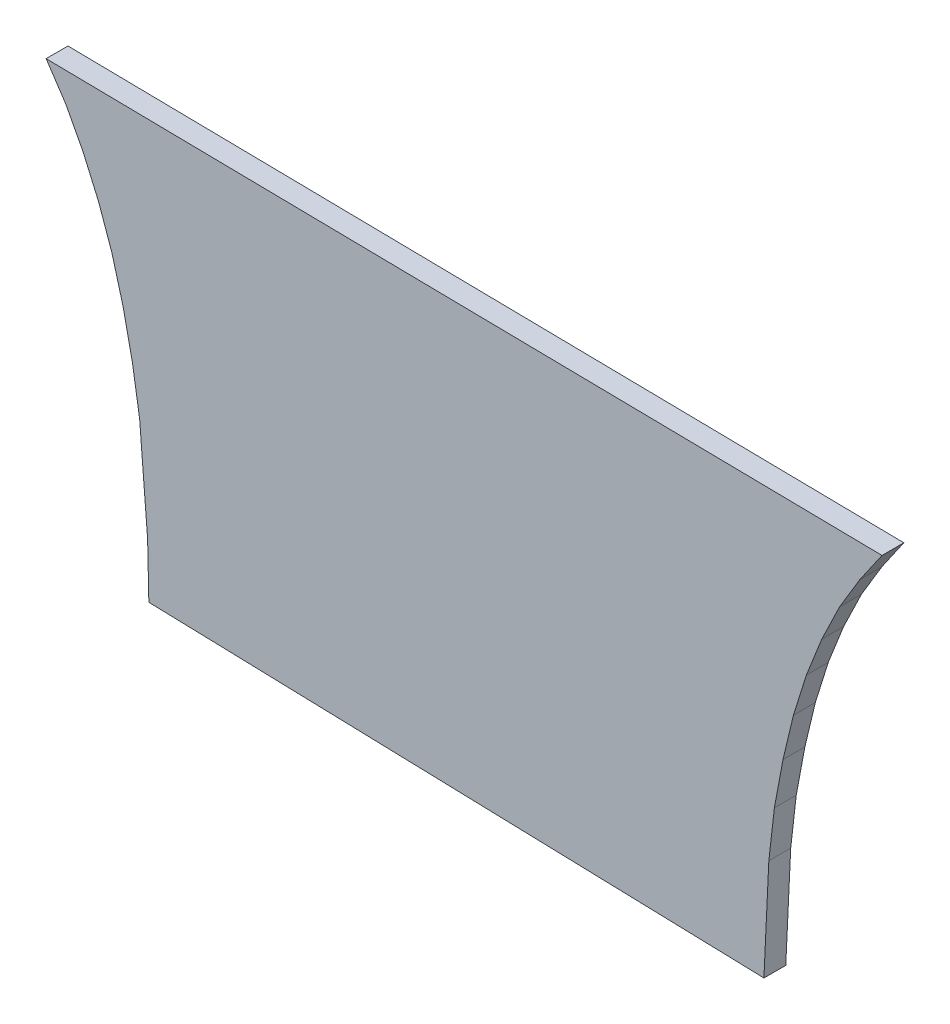
ISO-10303-21;
HEADER;
FILE_DESCRIPTION(('STEP AP214'),'2;1');
FILE_NAME('part.step','',(''),(''),'','','');
FILE_SCHEMA(('AUTOMOTIVE_DESIGN { 1 0 10303 214 1 1 1 1 }'));
ENDSEC;
DATA;
#1=APPLICATION_CONTEXT('core data for automotive mechanical design processes');
#2=APPLICATION_PROTOCOL_DEFINITION('international standard','automotive_design',2000,#1);
#3=PRODUCT_CONTEXT('',#1,'mechanical');
#4=PRODUCT('Part','Part','',(#3));
#5=PRODUCT_RELATED_PRODUCT_CATEGORY('part','',(#4));
#6=PRODUCT_DEFINITION_FORMATION('','',#4);
#7=PRODUCT_DEFINITION_CONTEXT('part definition',#1,'design');
#8=PRODUCT_DEFINITION('design','',#6,#7);
#9=PRODUCT_DEFINITION_SHAPE('','',#8);
#10=(LENGTH_UNIT() NAMED_UNIT(*) SI_UNIT(.MILLI.,.METRE.));
#11=(NAMED_UNIT(*) PLANE_ANGLE_UNIT() SI_UNIT($,.RADIAN.));
#12=(NAMED_UNIT(*) SI_UNIT($,.STERADIAN.) SOLID_ANGLE_UNIT());
#13=UNCERTAINTY_MEASURE_WITH_UNIT(LENGTH_MEASURE(1.E-05),#10,'distance_accuracy_value','');
#14=(GEOMETRIC_REPRESENTATION_CONTEXT(3) GLOBAL_UNCERTAINTY_ASSIGNED_CONTEXT((#13)) GLOBAL_UNIT_ASSIGNED_CONTEXT((#10,
#11,#12)) REPRESENTATION_CONTEXT('',''));
#15=CARTESIAN_POINT('',(0.,0.,0.));
#16=DIRECTION('',(0.,0.,1.));
#17=DIRECTION('',(1.,0.,0.));
#18=AXIS2_PLACEMENT_3D('',#15,#16,#17);
#19=CARTESIAN_POINT('',(57.9000015258789,74.088996887207,0.));
#20=DIRECTION('',(-0.998881716244748,0.0472791386548672,0.));
#21=DIRECTION('',(0.0472791386548672,0.998881716244748,0.));
#22=AXIS2_PLACEMENT_3D('',#19,#20,#21);
#23=PLANE('',#22);
#24=DIRECTION('',(0.0472791386548672,0.998881716244748,0.));
#25=VECTOR('',#24,1.);
#26=CARTESIAN_POINT('',(57.9000015258789,74.088996887207,0.03556));
#27=LINE('',#26,#25);
#28=CARTESIAN_POINT('',(57.9000015258789,74.088996887207,0.03556));
#29=VERTEX_POINT('',#28);
#30=CARTESIAN_POINT('',(57.9080009460449,74.2580032348633,0.03556));
#31=VERTEX_POINT('',#30);
#32=EDGE_CURVE('E11',#29,#31,#27,.T.);
#33=ORIENTED_EDGE('',*,*,#32,.F.);
#34=DIRECTION('',(0.,0.,1.));
#35=VECTOR('',#34,1.);
#36=CARTESIAN_POINT('',(57.9000015258789,74.088996887207,0.));
#37=LINE('',#36,#35);
#38=CARTESIAN_POINT('',(57.9000015258789,74.088996887207,0.));
#39=VERTEX_POINT('',#38);
#40=EDGE_CURVE('E24',#39,#29,#37,.T.);
#41=ORIENTED_EDGE('',*,*,#40,.F.);
#42=DIRECTION('',(0.0472791386548672,0.998881716244748,0.));
#43=VECTOR('',#42,1.);
#44=CARTESIAN_POINT('',(57.9000015258789,74.088996887207,0.));
#45=LINE('',#44,#43);
#46=CARTESIAN_POINT('',(57.9080009460449,74.2580032348633,0.));
#47=VERTEX_POINT('',#46);
#48=EDGE_CURVE('E172',#39,#47,#45,.T.);
#49=ORIENTED_EDGE('',*,*,#48,.T.);
#50=DIRECTION('',(0.,0.,1.));
#51=VECTOR('',#50,1.);
#52=CARTESIAN_POINT('',(57.9080009460449,74.2580032348633,0.));
#53=LINE('',#52,#51);
#54=EDGE_CURVE('E37',#47,#31,#53,.T.);
#55=ORIENTED_EDGE('',*,*,#54,.T.);
#56=EDGE_LOOP('',(#33,#41,#49,#55));
#57=FACE_BOUND('',#56,.T.);
#58=ADVANCED_FACE('F17',(#57),#23,.F.);
#59=CARTESIAN_POINT('',(57.9080009460449,74.2580032348633,0.));
#60=DIRECTION('',(-0.993573898541037,0.113185282338145,0.));
#61=DIRECTION('',(0.113185282338145,0.993573898541037,0.));
#62=AXIS2_PLACEMENT_3D('',#59,#60,#61);
#63=PLANE('',#62);
#64=DIRECTION('',(0.113185282338145,0.993573898541037,0.));
#65=VECTOR('',#64,1.);
#66=CARTESIAN_POINT('',(57.9080009460449,74.2580032348633,0.03556));
#67=LINE('',#66,#65);
#68=CARTESIAN_POINT('',(57.9169998168945,74.3369979858398,0.03556));
#69=VERTEX_POINT('',#68);
#70=EDGE_CURVE('E308',#31,#69,#67,.T.);
#71=ORIENTED_EDGE('',*,*,#70,.F.);
#72=ORIENTED_EDGE('',*,*,#54,.F.);
#73=DIRECTION('',(0.113185282338145,0.993573898541037,0.));
#74=VECTOR('',#73,1.);
#75=CARTESIAN_POINT('',(57.9080009460449,74.2580032348633,0.));
#76=LINE('',#75,#74);
#77=CARTESIAN_POINT('',(57.9169998168945,74.3369979858398,0.));
#78=VERTEX_POINT('',#77);
#79=EDGE_CURVE('E305',#47,#78,#76,.T.);
#80=ORIENTED_EDGE('',*,*,#79,.T.);
#81=DIRECTION('',(0.,0.,1.));
#82=VECTOR('',#81,1.);
#83=CARTESIAN_POINT('',(57.9169998168945,74.3369979858398,0.));
#84=LINE('',#83,#82);
#85=EDGE_CURVE('E303',#78,#69,#84,.T.);
#86=ORIENTED_EDGE('',*,*,#85,.T.);
#87=EDGE_LOOP('',(#71,#72,#80,#86));
#88=FACE_BOUND('',#87,.T.);
#89=ADVANCED_FACE('F316',(#88),#63,.F.);
#90=CARTESIAN_POINT('',(57.9169998168945,74.3369979858398,0.));
#91=DIRECTION('',(-0.98302241310278,0.183485518059567,0.));
#92=DIRECTION('',(0.183485518059567,0.98302241310278,0.));
#93=AXIS2_PLACEMENT_3D('',#90,#91,#92);
#94=PLANE('',#93);
#95=DIRECTION('',(0.183485518059567,0.98302241310278,0.));
#96=VECTOR('',#95,1.);
#97=CARTESIAN_POINT('',(57.9169998168945,74.3369979858398,0.03556));
#98=LINE('',#97,#96);
#99=CARTESIAN_POINT('',(57.9309997558594,74.4120025634766,0.03556));
#100=VERTEX_POINT('',#99);
#101=EDGE_CURVE('E300',#69,#100,#98,.T.);
#102=ORIENTED_EDGE('',*,*,#101,.F.);
#103=ORIENTED_EDGE('',*,*,#85,.F.);
#104=DIRECTION('',(0.183485518059567,0.98302241310278,0.));
#105=VECTOR('',#104,1.);
#106=CARTESIAN_POINT('',(57.9169998168945,74.3369979858398,0.));
#107=LINE('',#106,#105);
#108=CARTESIAN_POINT('',(57.9309997558594,74.4120025634766,0.));
#109=VERTEX_POINT('',#108);
#110=EDGE_CURVE('E297',#78,#109,#107,.T.);
#111=ORIENTED_EDGE('',*,*,#110,.T.);
#112=DIRECTION('',(0.,0.,1.));
#113=VECTOR('',#112,1.);
#114=CARTESIAN_POINT('',(57.9309997558594,74.4120025634766,0.));
#115=LINE('',#114,#113);
#116=EDGE_CURVE('E295',#109,#100,#115,.T.);
#117=ORIENTED_EDGE('',*,*,#116,.T.);
#118=EDGE_LOOP('',(#102,#103,#111,#117));
#119=FACE_BOUND('',#118,.T.);
#120=ADVANCED_FACE('F322',(#119),#94,.F.);
#121=CARTESIAN_POINT('',(57.9309997558594,74.4120025634766,0.));
#122=DIRECTION('',(-0.972504330258907,0.232884794754134,0.));
#123=DIRECTION('',(0.232884794754134,0.972504330258907,0.));
#124=AXIS2_PLACEMENT_3D('',#121,#122,#123);
#125=PLANE('',#124);
#126=DIRECTION('',(0.232884794754134,0.972504330258907,0.));
#127=VECTOR('',#126,1.);
#128=CARTESIAN_POINT('',(57.9309997558594,74.4120025634766,0.03556));
#129=LINE('',#128,#127);
#130=CARTESIAN_POINT('',(57.9480018615723,74.4830017089844,0.03556));
#131=VERTEX_POINT('',#130);
#132=EDGE_CURVE('E292',#100,#131,#129,.T.);
#133=ORIENTED_EDGE('',*,*,#132,.F.);
#134=ORIENTED_EDGE('',*,*,#116,.F.);
#135=DIRECTION('',(0.232884794754134,0.972504330258907,0.));
#136=VECTOR('',#135,1.);
#137=CARTESIAN_POINT('',(57.9309997558594,74.4120025634766,0.));
#138=LINE('',#137,#136);
#139=CARTESIAN_POINT('',(57.9480018615723,74.4830017089844,0.));
#140=VERTEX_POINT('',#139);
#141=EDGE_CURVE('E289',#109,#140,#138,.T.);
#142=ORIENTED_EDGE('',*,*,#141,.T.);
#143=DIRECTION('',(0.,0.,1.));
#144=VECTOR('',#143,1.);
#145=CARTESIAN_POINT('',(57.9480018615723,74.4830017089844,0.));
#146=LINE('',#145,#144);
#147=EDGE_CURVE('E287',#140,#131,#146,.T.);
#148=ORIENTED_EDGE('',*,*,#147,.T.);
#149=EDGE_LOOP('',(#133,#134,#142,#148));
#150=FACE_BOUND('',#149,.T.);
#151=ADVANCED_FACE('F324',(#150),#125,.F.);
#152=CARTESIAN_POINT('',(57.9480018615723,74.4830017089844,0.));
#153=DIRECTION('',(-0.954228296684143,0.299079183172751,0.));
#154=DIRECTION('',(0.299079183172751,0.954228296684143,0.));
#155=AXIS2_PLACEMENT_3D('',#152,#153,#154);
#156=PLANE('',#155);
#157=DIRECTION('',(0.299079183172751,0.954228296684143,0.));
#158=VECTOR('',#157,1.);
#159=CARTESIAN_POINT('',(57.9480018615723,74.4830017089844,0.03556));
#160=LINE('',#159,#158);
#161=CARTESIAN_POINT('',(57.9690017700195,74.5500030517578,0.03556));
#162=VERTEX_POINT('',#161);
#163=EDGE_CURVE('E284',#131,#162,#160,.T.);
#164=ORIENTED_EDGE('',*,*,#163,.F.);
#165=ORIENTED_EDGE('',*,*,#147,.F.);
#166=DIRECTION('',(0.299079183172751,0.954228296684143,0.));
#167=VECTOR('',#166,1.);
#168=CARTESIAN_POINT('',(57.9480018615723,74.4830017089844,0.));
#169=LINE('',#168,#167);
#170=CARTESIAN_POINT('',(57.9690017700195,74.5500030517578,0.));
#171=VERTEX_POINT('',#170);
#172=EDGE_CURVE('E281',#140,#171,#169,.T.);
#173=ORIENTED_EDGE('',*,*,#172,.T.);
#174=DIRECTION('',(0.,0.,1.));
#175=VECTOR('',#174,1.);
#176=CARTESIAN_POINT('',(57.9690017700195,74.5500030517578,0.));
#177=LINE('',#176,#175);
#178=EDGE_CURVE('E279',#171,#162,#177,.T.);
#179=ORIENTED_EDGE('',*,*,#178,.T.);
#180=EDGE_LOOP('',(#164,#165,#173,#179));
#181=FACE_BOUND('',#180,.T.);
#182=ADVANCED_FACE('F329',(#181),#156,.F.);
#183=CARTESIAN_POINT('',(57.9690017700195,74.5500030517578,0.));
#184=DIRECTION('',(-0.929494080402685,0.368837029725009,0.));
#185=DIRECTION('',(0.368837029725009,0.929494080402685,0.));
#186=AXIS2_PLACEMENT_3D('',#183,#184,#185);
#187=PLANE('',#186);
#188=DIRECTION('',(0.368837029725009,0.929494080402685,0.));
#189=VECTOR('',#188,1.);
#190=CARTESIAN_POINT('',(57.9690017700195,74.5500030517578,0.03556));
#191=LINE('',#190,#189);
#192=CARTESIAN_POINT('',(57.9939994812012,74.6129989624023,0.03556));
#193=VERTEX_POINT('',#192);
#194=EDGE_CURVE('E276',#162,#193,#191,.T.);
#195=ORIENTED_EDGE('',*,*,#194,.F.);
#196=ORIENTED_EDGE('',*,*,#178,.F.);
#197=DIRECTION('',(0.368837029725009,0.929494080402685,0.));
#198=VECTOR('',#197,1.);
#199=CARTESIAN_POINT('',(57.9690017700195,74.5500030517578,0.));
#200=LINE('',#199,#198);
#201=CARTESIAN_POINT('',(57.9939994812012,74.6129989624023,0.));
#202=VERTEX_POINT('',#201);
#203=EDGE_CURVE('E273',#171,#202,#200,.T.);
#204=ORIENTED_EDGE('',*,*,#203,.T.);
#205=DIRECTION('',(0.,0.,1.));
#206=VECTOR('',#205,1.);
#207=CARTESIAN_POINT('',(57.9939994812012,74.6129989624023,0.));
#208=LINE('',#207,#206);
#209=EDGE_CURVE('E271',#202,#193,#208,.T.);
#210=ORIENTED_EDGE('',*,*,#209,.T.);
#211=EDGE_LOOP('',(#195,#196,#204,#210));
#212=FACE_BOUND('',#211,.T.);
#213=ADVANCED_FACE('F332',(#212),#187,.F.);
#214=CARTESIAN_POINT('',(57.9939994812012,74.6129989624024,0.));
#215=DIRECTION('',(-0.900345962325327,0.435174847761771,0.));
#216=DIRECTION('',(0.435174847761771,0.900345962325327,0.));
#217=AXIS2_PLACEMENT_3D('',#214,#215,#216);
#218=PLANE('',#217);
#219=DIRECTION('',(0.435174847761771,0.900345962325327,0.));
#220=VECTOR('',#219,1.);
#221=CARTESIAN_POINT('',(57.9939994812012,74.6129989624023,0.03556));
#222=LINE('',#221,#220);
#223=CARTESIAN_POINT('',(58.0229988098145,74.6729965209961,0.03556));
#224=VERTEX_POINT('',#223);
#225=EDGE_CURVE('E268',#193,#224,#222,.T.);
#226=ORIENTED_EDGE('',*,*,#225,.F.);
#227=ORIENTED_EDGE('',*,*,#209,.F.);
#228=DIRECTION('',(0.435174847761771,0.900345962325327,0.));
#229=VECTOR('',#228,1.);
#230=CARTESIAN_POINT('',(57.9939994812012,74.6129989624023,0.));
#231=LINE('',#230,#229);
#232=CARTESIAN_POINT('',(58.0229988098145,74.6729965209961,0.));
#233=VERTEX_POINT('',#232);
#234=EDGE_CURVE('E265',#202,#233,#231,.T.);
#235=ORIENTED_EDGE('',*,*,#234,.T.);
#236=DIRECTION('',(0.,0.,1.));
#237=VECTOR('',#236,1.);
#238=CARTESIAN_POINT('',(58.0229988098145,74.6729965209961,0.));
#239=LINE('',#238,#237);
#240=EDGE_CURVE('E263',#233,#224,#239,.T.);
#241=ORIENTED_EDGE('',*,*,#240,.T.);
#242=EDGE_LOOP('',(#226,#227,#235,#241));
#243=FACE_BOUND('',#242,.T.);
#244=ADVANCED_FACE('F337',(#243),#218,.F.);
#245=CARTESIAN_POINT('',(58.0229988098145,74.6729965209961,0.));
#246=DIRECTION('',(-0.857487678013795,0.514504501491007,0.));
#247=DIRECTION('',(0.514504501491007,0.857487678013795,0.));
#248=AXIS2_PLACEMENT_3D('',#245,#246,#247);
#249=PLANE('',#248);
#250=DIRECTION('',(0.514504501491007,0.857487678013795,0.));
#251=VECTOR('',#250,1.);
#252=CARTESIAN_POINT('',(58.0229988098145,74.6729965209961,0.03556));
#253=LINE('',#252,#251);
#254=CARTESIAN_POINT('',(58.0559997558594,74.7279968261719,0.03556));
#255=VERTEX_POINT('',#254);
#256=EDGE_CURVE('E260',#224,#255,#253,.T.);
#257=ORIENTED_EDGE('',*,*,#256,.F.);
#258=ORIENTED_EDGE('',*,*,#240,.F.);
#259=DIRECTION('',(0.514504501491007,0.857487678013795,0.));
#260=VECTOR('',#259,1.);
#261=CARTESIAN_POINT('',(58.0229988098145,74.6729965209961,0.));
#262=LINE('',#261,#260);
#263=CARTESIAN_POINT('',(58.0559997558594,74.7279968261719,0.));
#264=VERTEX_POINT('',#263);
#265=EDGE_CURVE('E257',#233,#264,#262,.T.);
#266=ORIENTED_EDGE('',*,*,#265,.T.);
#267=DIRECTION('',(0.,0.,1.));
#268=VECTOR('',#267,1.);
#269=CARTESIAN_POINT('',(58.0559997558594,74.7279968261719,0.));
#270=LINE('',#269,#268);
#271=EDGE_CURVE('E255',#264,#255,#270,.T.);
#272=ORIENTED_EDGE('',*,*,#271,.T.);
#273=EDGE_LOOP('',(#257,#258,#266,#272));
#274=FACE_BOUND('',#273,.T.);
#275=ADVANCED_FACE('F340',(#274),#249,.F.);
#276=CARTESIAN_POINT('',(58.0559997558594,74.7279968261719,0.));
#277=DIRECTION('',(-0.822207390607001,0.569188024146,0.));
#278=DIRECTION('',(0.569188024146,0.822207390607001,0.));
#279=AXIS2_PLACEMENT_3D('',#276,#277,#278);
#280=PLANE('',#279);
#281=DIRECTION('',(0.569188024146,0.822207390607001,0.));
#282=VECTOR('',#281,1.);
#283=CARTESIAN_POINT('',(58.0559997558594,74.7279968261719,0.03556));
#284=LINE('',#283,#282);
#285=CARTESIAN_POINT('',(58.0919990539551,74.7799987792969,0.03556));
#286=VERTEX_POINT('',#285);
#287=EDGE_CURVE('E252',#255,#286,#284,.T.);
#288=ORIENTED_EDGE('',*,*,#287,.F.);
#289=ORIENTED_EDGE('',*,*,#271,.F.);
#290=DIRECTION('',(0.569188024146,0.822207390607001,0.));
#291=VECTOR('',#290,1.);
#292=CARTESIAN_POINT('',(58.0559997558594,74.7279968261719,0.));
#293=LINE('',#292,#291);
#294=CARTESIAN_POINT('',(58.0919990539551,74.7799987792969,0.));
#295=VERTEX_POINT('',#294);
#296=EDGE_CURVE('E249',#264,#295,#293,.T.);
#297=ORIENTED_EDGE('',*,*,#296,.T.);
#298=DIRECTION('',(0.,0.,1.));
#299=VECTOR('',#298,1.);
#300=CARTESIAN_POINT('',(58.0919990539551,74.7799987792969,0.));
#301=LINE('',#300,#299);
#302=EDGE_CURVE('E247',#295,#286,#301,.T.);
#303=ORIENTED_EDGE('',*,*,#302,.T.);
#304=EDGE_LOOP('',(#288,#289,#297,#303));
#305=FACE_BOUND('',#304,.T.);
#306=ADVANCED_FACE('F345',(#305),#280,.F.);
#307=CARTESIAN_POINT('',(58.0919990539551,74.7799987792969,0.));
#308=DIRECTION('',(-0.0147182815895166,-0.999891680226939,0.));
#309=DIRECTION('',(-0.999891680226939,0.0147182815895166,0.));
#310=AXIS2_PLACEMENT_3D('',#307,#308,#309);
#311=PLANE('',#310);
#312=DIRECTION('',(-0.999891680226939,0.0147182815895166,0.));
#313=VECTOR('',#312,1.);
#314=CARTESIAN_POINT('',(58.0919990539551,74.7799987792969,0.03556));
#315=LINE('',#314,#313);
#316=CARTESIAN_POINT('',(56.7330017089844,74.8000030517578,0.03556));
#317=VERTEX_POINT('',#316);
#318=EDGE_CURVE('E244',#286,#317,#315,.T.);
#319=ORIENTED_EDGE('',*,*,#318,.F.);
#320=ORIENTED_EDGE('',*,*,#302,.F.);
#321=DIRECTION('',(-0.999891680226939,0.0147182815895166,0.));
#322=VECTOR('',#321,1.);
#323=CARTESIAN_POINT('',(58.0919990539551,74.7799987792969,0.));
#324=LINE('',#323,#322);
#325=CARTESIAN_POINT('',(56.7330017089844,74.8000030517578,0.));
#326=VERTEX_POINT('',#325);
#327=EDGE_CURVE('E241',#295,#326,#324,.T.);
#328=ORIENTED_EDGE('',*,*,#327,.T.);
#329=DIRECTION('',(0.,0.,1.));
#330=VECTOR('',#329,1.);
#331=CARTESIAN_POINT('',(56.7330017089844,74.8000030517578,0.));
#332=LINE('',#331,#330);
#333=EDGE_CURVE('E239',#326,#317,#332,.T.);
#334=ORIENTED_EDGE('',*,*,#333,.T.);
#335=EDGE_LOOP('',(#319,#320,#328,#334));
#336=FACE_BOUND('',#335,.T.);
#337=ADVANCED_FACE('F348',(#336),#311,.F.);
#338=CARTESIAN_POINT('',(56.7330017089844,74.8000030517578,0.));
#339=DIRECTION('',(0.832090983134532,0.554639158179629,0.));
#340=DIRECTION('',(0.554639158179629,-0.832090983134532,0.));
#341=AXIS2_PLACEMENT_3D('',#338,#339,#340);
#342=PLANE('',#341);
#343=DIRECTION('',(0.554639158179629,-0.832090983134532,0.));
#344=VECTOR('',#343,1.);
#345=CARTESIAN_POINT('',(56.7330017089844,74.8000030517578,0.03556));
#346=LINE('',#345,#344);
#347=CARTESIAN_POINT('',(56.7649993896484,74.7519989013672,0.03556));
#348=VERTEX_POINT('',#347);
#349=EDGE_CURVE('E236',#317,#348,#346,.T.);
#350=ORIENTED_EDGE('',*,*,#349,.F.);
#351=ORIENTED_EDGE('',*,*,#333,.F.);
#352=DIRECTION('',(0.554639158179629,-0.832090983134532,0.));
#353=VECTOR('',#352,1.);
#354=CARTESIAN_POINT('',(56.7330017089844,74.8000030517578,0.));
#355=LINE('',#354,#353);
#356=CARTESIAN_POINT('',(56.7649993896484,74.7519989013672,0.));
#357=VERTEX_POINT('',#356);
#358=EDGE_CURVE('E233',#326,#357,#355,.T.);
#359=ORIENTED_EDGE('',*,*,#358,.T.);
#360=DIRECTION('',(0.,0.,1.));
#361=VECTOR('',#360,1.);
#362=CARTESIAN_POINT('',(56.7649993896484,74.7519989013672,0.));
#363=LINE('',#362,#361);
#364=EDGE_CURVE('E231',#357,#348,#363,.T.);
#365=ORIENTED_EDGE('',*,*,#364,.T.);
#366=EDGE_LOOP('',(#350,#351,#359,#365));
#367=FACE_BOUND('',#366,.T.);
#368=ADVANCED_FACE('F353',(#367),#342,.F.);
#369=CARTESIAN_POINT('',(56.7649993896484,74.7519989013672,0.));
#370=DIRECTION('',(0.884199335207502,0.467109768275735,0.));
#371=DIRECTION('',(0.467109768275735,-0.884199335207502,0.));
#372=AXIS2_PLACEMENT_3D('',#369,#370,#371);
#373=PLANE('',#372);
#374=DIRECTION('',(0.467109768275735,-0.884199335207502,0.));
#375=VECTOR('',#374,1.);
#376=CARTESIAN_POINT('',(56.7649993896484,74.7519989013672,0.03556));
#377=LINE('',#376,#375);
#378=CARTESIAN_POINT('',(56.7929992675781,74.6989974975586,0.03556));
#379=VERTEX_POINT('',#378);
#380=EDGE_CURVE('E228',#348,#379,#377,.T.);
#381=ORIENTED_EDGE('',*,*,#380,.F.);
#382=ORIENTED_EDGE('',*,*,#364,.F.);
#383=DIRECTION('',(0.467109768275735,-0.884199335207502,0.));
#384=VECTOR('',#383,1.);
#385=CARTESIAN_POINT('',(56.7649993896484,74.7519989013672,0.));
#386=LINE('',#385,#384);
#387=CARTESIAN_POINT('',(56.7929992675781,74.6989974975586,0.));
#388=VERTEX_POINT('',#387);
#389=EDGE_CURVE('E225',#357,#388,#386,.T.);
#390=ORIENTED_EDGE('',*,*,#389,.T.);
#391=DIRECTION('',(0.,0.,1.));
#392=VECTOR('',#391,1.);
#393=CARTESIAN_POINT('',(56.7929992675781,74.6989974975586,0.));
#394=LINE('',#393,#392);
#395=EDGE_CURVE('E223',#388,#379,#394,.T.);
#396=ORIENTED_EDGE('',*,*,#395,.T.);
#397=EDGE_LOOP('',(#381,#382,#390,#396));
#398=FACE_BOUND('',#397,.T.);
#399=ADVANCED_FACE('F356',(#398),#373,.F.);
#400=CARTESIAN_POINT('',(56.7929992675781,74.6989974975586,0.));
#401=DIRECTION('',(0.915777134064196,0.401686744522604,0.));
#402=DIRECTION('',(0.401686744522604,-0.915777134064196,0.));
#403=AXIS2_PLACEMENT_3D('',#400,#401,#402);
#404=PLANE('',#403);
#405=DIRECTION('',(0.401686744522604,-0.915777134064196,0.));
#406=VECTOR('',#405,1.);
#407=CARTESIAN_POINT('',(56.7929992675781,74.6989974975586,0.03556));
#408=LINE('',#407,#406);
#409=CARTESIAN_POINT('',(56.818000793457,74.6419982910156,0.03556));
#410=VERTEX_POINT('',#409);
#411=EDGE_CURVE('E220',#379,#410,#408,.T.);
#412=ORIENTED_EDGE('',*,*,#411,.F.);
#413=ORIENTED_EDGE('',*,*,#395,.F.);
#414=DIRECTION('',(0.401686744522604,-0.915777134064196,0.));
#415=VECTOR('',#414,1.);
#416=CARTESIAN_POINT('',(56.7929992675781,74.6989974975586,0.));
#417=LINE('',#416,#415);
#418=CARTESIAN_POINT('',(56.818000793457,74.6419982910156,0.));
#419=VERTEX_POINT('',#418);
#420=EDGE_CURVE('E217',#388,#419,#417,.T.);
#421=ORIENTED_EDGE('',*,*,#420,.T.);
#422=DIRECTION('',(0.,0.,1.));
#423=VECTOR('',#422,1.);
#424=CARTESIAN_POINT('',(56.818000793457,74.6419982910156,0.));
#425=LINE('',#424,#423);
#426=EDGE_CURVE('E215',#419,#410,#425,.T.);
#427=ORIENTED_EDGE('',*,*,#426,.T.);
#428=EDGE_LOOP('',(#412,#413,#421,#427));
#429=FACE_BOUND('',#428,.T.);
#430=ADVANCED_FACE('F361',(#429),#404,.F.);
#431=CARTESIAN_POINT('',(56.818000793457,74.6419982910156,0.));
#432=DIRECTION('',(0.942424797798671,0.334418152160038,0.));
#433=DIRECTION('',(0.334418152160038,-0.942424797798671,0.));
#434=AXIS2_PLACEMENT_3D('',#431,#432,#433);
#435=PLANE('',#434);
#436=DIRECTION('',(0.334418152160038,-0.942424797798671,0.));
#437=VECTOR('',#436,1.);
#438=CARTESIAN_POINT('',(56.818000793457,74.6419982910156,0.03556));
#439=LINE('',#438,#437);
#440=CARTESIAN_POINT('',(56.8400001525879,74.5800018310547,0.03556));
#441=VERTEX_POINT('',#440);
#442=EDGE_CURVE('E212',#410,#441,#439,.T.);
#443=ORIENTED_EDGE('',*,*,#442,.F.);
#444=ORIENTED_EDGE('',*,*,#426,.F.);
#445=DIRECTION('',(0.334418152160038,-0.942424797798671,0.));
#446=VECTOR('',#445,1.);
#447=CARTESIAN_POINT('',(56.818000793457,74.6419982910156,0.));
#448=LINE('',#447,#446);
#449=CARTESIAN_POINT('',(56.8400001525879,74.5800018310547,0.));
#450=VERTEX_POINT('',#449);
#451=EDGE_CURVE('E209',#419,#450,#448,.T.);
#452=ORIENTED_EDGE('',*,*,#451,.T.);
#453=DIRECTION('',(0.,0.,1.));
#454=VECTOR('',#453,1.);
#455=CARTESIAN_POINT('',(56.8400001525879,74.5800018310547,0.));
#456=LINE('',#455,#454);
#457=EDGE_CURVE('E207',#450,#441,#456,.T.);
#458=ORIENTED_EDGE('',*,*,#457,.T.);
#459=EDGE_LOOP('',(#443,#444,#452,#458));
#460=FACE_BOUND('',#459,.T.);
#461=ADVANCED_FACE('F364',(#460),#435,.F.);
#462=CARTESIAN_POINT('',(56.8400001525879,74.5800018310547,0.));
#463=DIRECTION('',(0.964759960824443,0.263131560231797,0.));
#464=DIRECTION('',(0.263131560231797,-0.964759960824443,0.));
#465=AXIS2_PLACEMENT_3D('',#462,#463,#464);
#466=PLANE('',#465);
#467=DIRECTION('',(0.263131560231797,-0.964759960824443,0.));
#468=VECTOR('',#467,1.);
#469=CARTESIAN_POINT('',(56.8400001525879,74.5800018310547,0.03556));
#470=LINE('',#469,#468);
#471=CARTESIAN_POINT('',(56.8580017089844,74.5139999389648,0.03556));
#472=VERTEX_POINT('',#471);
#473=EDGE_CURVE('E204',#441,#472,#470,.T.);
#474=ORIENTED_EDGE('',*,*,#473,.F.);
#475=ORIENTED_EDGE('',*,*,#457,.F.);
#476=DIRECTION('',(0.263131560231797,-0.964759960824443,0.));
#477=VECTOR('',#476,1.);
#478=CARTESIAN_POINT('',(56.8400001525879,74.5800018310547,0.));
#479=LINE('',#478,#477);
#480=CARTESIAN_POINT('',(56.8580017089844,74.5139999389648,0.));
#481=VERTEX_POINT('',#480);
#482=EDGE_CURVE('E201',#450,#481,#479,.T.);
#483=ORIENTED_EDGE('',*,*,#482,.T.);
#484=DIRECTION('',(0.,0.,1.));
#485=VECTOR('',#484,1.);
#486=CARTESIAN_POINT('',(56.8580017089844,74.5139999389648,0.));
#487=LINE('',#486,#485);
#488=EDGE_CURVE('E199',#481,#472,#487,.T.);
#489=ORIENTED_EDGE('',*,*,#488,.T.);
#490=EDGE_LOOP('',(#474,#475,#483,#489));
#491=FACE_BOUND('',#490,.T.);
#492=ADVANCED_FACE('F369',(#491),#466,.F.);
#493=CARTESIAN_POINT('',(56.8580017089844,74.5139999389648,0.));
#494=DIRECTION('',(0.977803973649935,0.209521810593545,0.));
#495=DIRECTION('',(0.209521810593545,-0.977803973649935,0.));
#496=AXIS2_PLACEMENT_3D('',#493,#494,#495);
#497=PLANE('',#496);
#498=DIRECTION('',(0.209521810593545,-0.977803973649935,0.));
#499=VECTOR('',#498,1.);
#500=CARTESIAN_POINT('',(56.8580017089844,74.5139999389648,0.03556));
#501=LINE('',#500,#499);
#502=CARTESIAN_POINT('',(56.8730010986328,74.4440002441406,0.03556));
#503=VERTEX_POINT('',#502);
#504=EDGE_CURVE('E196',#472,#503,#501,.T.);
#505=ORIENTED_EDGE('',*,*,#504,.F.);
#506=ORIENTED_EDGE('',*,*,#488,.F.);
#507=DIRECTION('',(0.209521810593545,-0.977803973649935,0.));
#508=VECTOR('',#507,1.);
#509=CARTESIAN_POINT('',(56.8580017089844,74.5139999389648,0.));
#510=LINE('',#509,#508);
#511=CARTESIAN_POINT('',(56.8730010986328,74.4440002441406,0.));
#512=VERTEX_POINT('',#511);
#513=EDGE_CURVE('E193',#481,#512,#510,.T.);
#514=ORIENTED_EDGE('',*,*,#513,.T.);
#515=DIRECTION('',(0.,0.,1.));
#516=VECTOR('',#515,1.);
#517=CARTESIAN_POINT('',(56.8730010986328,74.4440002441406,0.));
#518=LINE('',#517,#516);
#519=EDGE_CURVE('E191',#512,#503,#518,.T.);
#520=ORIENTED_EDGE('',*,*,#519,.T.);
#521=EDGE_LOOP('',(#505,#506,#514,#520));
#522=FACE_BOUND('',#521,.T.);
#523=ADVANCED_FACE('F372',(#522),#497,.F.);
#524=CARTESIAN_POINT('',(56.8730010986328,74.4440002441406,0.));
#525=DIRECTION('',(0.98744533283152,0.157961117586731,0.));
#526=DIRECTION('',(0.157961117586731,-0.98744533283152,0.));
#527=AXIS2_PLACEMENT_3D('',#524,#525,#526);
#528=PLANE('',#527);
#529=DIRECTION('',(0.157961117586731,-0.98744533283152,0.));
#530=VECTOR('',#529,1.);
#531=CARTESIAN_POINT('',(56.8730010986328,74.4440002441406,0.03556));
#532=LINE('',#531,#530);
#533=CARTESIAN_POINT('',(56.8849983215332,74.3690032958984,0.03556));
#534=VERTEX_POINT('',#533);
#535=EDGE_CURVE('E188',#503,#534,#532,.T.);
#536=ORIENTED_EDGE('',*,*,#535,.F.);
#537=ORIENTED_EDGE('',*,*,#519,.F.);
#538=DIRECTION('',(0.157961117586731,-0.98744533283152,0.));
#539=VECTOR('',#538,1.);
#540=CARTESIAN_POINT('',(56.8730010986328,74.4440002441406,0.));
#541=LINE('',#540,#539);
#542=CARTESIAN_POINT('',(56.8849983215332,74.3690032958984,0.));
#543=VERTEX_POINT('',#542);
#544=EDGE_CURVE('E185',#512,#543,#541,.T.);
#545=ORIENTED_EDGE('',*,*,#544,.T.);
#546=DIRECTION('',(0.,0.,1.));
#547=VECTOR('',#546,1.);
#548=CARTESIAN_POINT('',(56.8849983215332,74.3690032958984,0.));
#549=LINE('',#548,#547);
#550=EDGE_CURVE('E183',#543,#534,#549,.T.);
#551=ORIENTED_EDGE('',*,*,#550,.T.);
#552=EDGE_LOOP('',(#536,#537,#545,#551));
#553=FACE_BOUND('',#552,.T.);
#554=ADVANCED_FACE('F377',(#553),#528,.F.);
#555=CARTESIAN_POINT('',(56.8849983215332,74.3690032958984,0.));
#556=DIRECTION('',(0.996834535416527,0.0795041445518259,0.));
#557=DIRECTION('',(0.0795041445518259,-0.996834535416527,0.));
#558=AXIS2_PLACEMENT_3D('',#555,#556,#557);
#559=PLANE('',#558);
#560=DIRECTION('',(0.0795041445518259,-0.996834535416526,0.));
#561=VECTOR('',#560,1.);
#562=CARTESIAN_POINT('',(56.8849983215332,74.3690032958984,0.03556));
#563=LINE('',#562,#561);
#564=CARTESIAN_POINT('',(56.8979988098145,74.2060012817383,0.03556));
#565=VERTEX_POINT('',#564);
#566=EDGE_CURVE('E180',#534,#565,#563,.T.);
#567=ORIENTED_EDGE('',*,*,#566,.F.);
#568=ORIENTED_EDGE('',*,*,#550,.F.);
#569=DIRECTION('',(0.0795041445518259,-0.996834535416526,0.));
#570=VECTOR('',#569,1.);
#571=CARTESIAN_POINT('',(56.8849983215332,74.3690032958984,0.));
#572=LINE('',#571,#570);
#573=CARTESIAN_POINT('',(56.8979988098145,74.2060012817383,0.));
#574=VERTEX_POINT('',#573);
#575=EDGE_CURVE('E178',#543,#574,#572,.T.);
#576=ORIENTED_EDGE('',*,*,#575,.T.);
#577=DIRECTION('',(0.,0.,1.));
#578=VECTOR('',#577,1.);
#579=CARTESIAN_POINT('',(56.8979988098145,74.2060012817383,0.));
#580=LINE('',#579,#578);
#581=EDGE_CURVE('E163',#574,#565,#580,.T.);
#582=ORIENTED_EDGE('',*,*,#581,.T.);
#583=EDGE_LOOP('',(#567,#568,#576,#582));
#584=FACE_BOUND('',#583,.T.);
#585=ADVANCED_FACE('F379',(#584),#559,.F.);
#586=CARTESIAN_POINT('',(56.8979988098145,74.2060012817383,0.));
#587=DIRECTION('',(0.999741163940203,0.0227509367606678,0.));
#588=DIRECTION('',(0.0227509367606678,-0.999741163940203,0.));
#589=AXIS2_PLACEMENT_3D('',#586,#587,#588);
#590=PLANE('',#589);
#591=DIRECTION('',(0.0227509367606678,-0.999741163940203,0.));
#592=VECTOR('',#591,1.);
#593=CARTESIAN_POINT('',(56.8979988098145,74.2060012817383,0.03556));
#594=LINE('',#593,#592);
#595=CARTESIAN_POINT('',(56.9000015258789,74.1179962158203,0.03556));
#596=VERTEX_POINT('',#595);
#597=EDGE_CURVE('E167',#565,#596,#594,.T.);
#598=ORIENTED_EDGE('',*,*,#597,.F.);
#599=ORIENTED_EDGE('',*,*,#581,.F.);
#600=DIRECTION('',(0.0227509367606678,-0.999741163940203,0.));
#601=VECTOR('',#600,1.);
#602=CARTESIAN_POINT('',(56.8979988098145,74.2060012817383,0.));
#603=LINE('',#602,#601);
#604=CARTESIAN_POINT('',(56.9000015258789,74.1179962158203,0.));
#605=VERTEX_POINT('',#604);
#606=EDGE_CURVE('E159',#574,#605,#603,.T.);
#607=ORIENTED_EDGE('',*,*,#606,.T.);
#608=DIRECTION('',(0.,0.,1.));
#609=VECTOR('',#608,1.);
#610=CARTESIAN_POINT('',(56.9000015258789,74.1179962158203,0.));
#611=LINE('',#610,#609);
#612=EDGE_CURVE('E149',#605,#596,#611,.T.);
#613=ORIENTED_EDGE('',*,*,#612,.T.);
#614=EDGE_LOOP('',(#598,#599,#607,#613));
#615=FACE_BOUND('',#614,.T.);
#616=ADVANCED_FACE('F162',(#615),#590,.F.);
#617=CARTESIAN_POINT('',(56.9000015258789,74.1179962158203,0.));
#618=DIRECTION('',(0.0289871426456208,0.999579784490084,0.));
#619=DIRECTION('',(0.999579784490084,-0.0289871426456208,0.));
#620=AXIS2_PLACEMENT_3D('',#617,#618,#619);
#621=PLANE('',#620);
#622=DIRECTION('',(0.999579784490084,-0.0289871426456208,0.));
#623=VECTOR('',#622,1.);
#624=CARTESIAN_POINT('',(56.9000015258789,74.1179962158203,0.03556));
#625=LINE('',#624,#623);
#626=EDGE_CURVE('E155',#596,#29,#625,.T.);
#627=ORIENTED_EDGE('',*,*,#626,.F.);
#628=ORIENTED_EDGE('',*,*,#612,.F.);
#629=DIRECTION('',(0.999579784490084,-0.0289871426456208,0.));
#630=VECTOR('',#629,1.);
#631=CARTESIAN_POINT('',(56.9000015258789,74.1179962158203,0.));
#632=LINE('',#631,#630);
#633=EDGE_CURVE('E153',#605,#39,#632,.T.);
#634=ORIENTED_EDGE('',*,*,#633,.T.);
#635=ORIENTED_EDGE('',*,*,#40,.T.);
#636=EDGE_LOOP('',(#627,#628,#634,#635));
#637=FACE_BOUND('',#636,.T.);
#638=ADVANCED_FACE('F151',(#637),#621,.F.);
#639=CARTESIAN_POINT('',(57.9000015258789,74.088996887207,0.));
#640=DIRECTION('',(0.,0.,1.));
#641=DIRECTION('',(1.,0.,0.));
#642=AXIS2_PLACEMENT_3D('',#639,#640,#641);
#643=PLANE('',#642);
#644=ORIENTED_EDGE('',*,*,#633,.F.);
#645=ORIENTED_EDGE('',*,*,#606,.F.);
#646=ORIENTED_EDGE('',*,*,#575,.F.);
#647=ORIENTED_EDGE('',*,*,#544,.F.);
#648=ORIENTED_EDGE('',*,*,#513,.F.);
#649=ORIENTED_EDGE('',*,*,#482,.F.);
#650=ORIENTED_EDGE('',*,*,#451,.F.);
#651=ORIENTED_EDGE('',*,*,#420,.F.);
#652=ORIENTED_EDGE('',*,*,#389,.F.);
#653=ORIENTED_EDGE('',*,*,#358,.F.);
#654=ORIENTED_EDGE('',*,*,#327,.F.);
#655=ORIENTED_EDGE('',*,*,#296,.F.);
#656=ORIENTED_EDGE('',*,*,#265,.F.);
#657=ORIENTED_EDGE('',*,*,#234,.F.);
#658=ORIENTED_EDGE('',*,*,#203,.F.);
#659=ORIENTED_EDGE('',*,*,#172,.F.);
#660=ORIENTED_EDGE('',*,*,#141,.F.);
#661=ORIENTED_EDGE('',*,*,#110,.F.);
#662=ORIENTED_EDGE('',*,*,#79,.F.);
#663=ORIENTED_EDGE('',*,*,#48,.F.);
#664=EDGE_LOOP('',(#644,#645,#646,#647,#648,#649,#650,#651,#652,#653,#654,#655,#656,#657,#658,
#659,#660,#661,#662,#663));
#665=FACE_BOUND('',#664,.T.);
#666=ADVANCED_FACE('F170',(#665),#643,.F.);
#667=CARTESIAN_POINT('',(57.9000015258789,74.088996887207,0.03556));
#668=DIRECTION('',(0.,0.,1.));
#669=DIRECTION('',(1.,0.,0.));
#670=AXIS2_PLACEMENT_3D('',#667,#668,#669);
#671=PLANE('',#670);
#672=ORIENTED_EDGE('',*,*,#32,.T.);
#673=ORIENTED_EDGE('',*,*,#70,.T.);
#674=ORIENTED_EDGE('',*,*,#101,.T.);
#675=ORIENTED_EDGE('',*,*,#132,.T.);
#676=ORIENTED_EDGE('',*,*,#163,.T.);
#677=ORIENTED_EDGE('',*,*,#194,.T.);
#678=ORIENTED_EDGE('',*,*,#225,.T.);
#679=ORIENTED_EDGE('',*,*,#256,.T.);
#680=ORIENTED_EDGE('',*,*,#287,.T.);
#681=ORIENTED_EDGE('',*,*,#318,.T.);
#682=ORIENTED_EDGE('',*,*,#349,.T.);
#683=ORIENTED_EDGE('',*,*,#380,.T.);
#684=ORIENTED_EDGE('',*,*,#411,.T.);
#685=ORIENTED_EDGE('',*,*,#442,.T.);
#686=ORIENTED_EDGE('',*,*,#473,.T.);
#687=ORIENTED_EDGE('',*,*,#504,.T.);
#688=ORIENTED_EDGE('',*,*,#535,.T.);
#689=ORIENTED_EDGE('',*,*,#566,.T.);
#690=ORIENTED_EDGE('',*,*,#597,.T.);
#691=ORIENTED_EDGE('',*,*,#626,.T.);
#692=EDGE_LOOP('',(#672,#673,#674,#675,#676,#677,#678,#679,#680,#681,#682,#683,#684,#685,#686,
#687,#688,#689,#690,#691));
#693=FACE_BOUND('',#692,.T.);
#694=ADVANCED_FACE('F319',(#693),#671,.T.);
#695=CLOSED_SHELL('',(#58,#89,#120,#151,#182,#213,#244,#275,#306,#337,#368,#399,#430,#461,#492,
#523,#554,#585,#616,#638,#666,#694));
#696=MANIFOLD_SOLID_BREP('B1',#695);
#697=ADVANCED_BREP_SHAPE_REPRESENTATION('',(#18,#696),#14);
#698=SHAPE_DEFINITION_REPRESENTATION(#9,#697);
ENDSEC;
END-ISO-10303-21;
